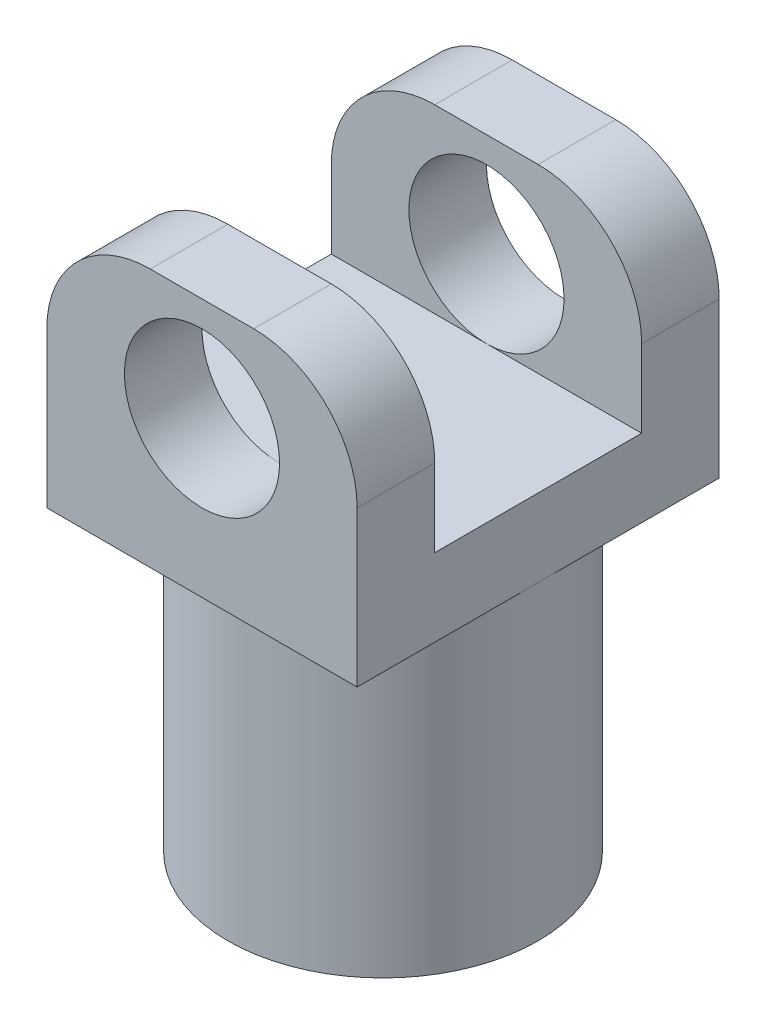
ISO-10303-21;
HEADER;
FILE_DESCRIPTION(('STEP AP214'),'2;1');
FILE_NAME('part.step','',(''),(''),'','','');
FILE_SCHEMA(('AUTOMOTIVE_DESIGN { 1 0 10303 214 1 1 1 1 }'));
ENDSEC;
DATA;
#1=APPLICATION_CONTEXT('core data for automotive mechanical design processes');
#2=APPLICATION_PROTOCOL_DEFINITION('international standard','automotive_design',2000,#1);
#3=PRODUCT_CONTEXT('',#1,'mechanical');
#4=PRODUCT('Part','Part','',(#3));
#5=PRODUCT_RELATED_PRODUCT_CATEGORY('part','',(#4));
#6=PRODUCT_DEFINITION_FORMATION('','',#4);
#7=PRODUCT_DEFINITION_CONTEXT('part definition',#1,'design');
#8=PRODUCT_DEFINITION('design','',#6,#7);
#9=PRODUCT_DEFINITION_SHAPE('','',#8);
#10=(LENGTH_UNIT() NAMED_UNIT(*) SI_UNIT(.MILLI.,.METRE.));
#11=(NAMED_UNIT(*) PLANE_ANGLE_UNIT() SI_UNIT($,.RADIAN.));
#12=(NAMED_UNIT(*) SI_UNIT($,.STERADIAN.) SOLID_ANGLE_UNIT());
#13=UNCERTAINTY_MEASURE_WITH_UNIT(LENGTH_MEASURE(1.E-05),#10,'distance_accuracy_value','');
#14=(GEOMETRIC_REPRESENTATION_CONTEXT(3) GLOBAL_UNCERTAINTY_ASSIGNED_CONTEXT((#13)) GLOBAL_UNIT_ASSIGNED_CONTEXT((#10,
#11,#12)) REPRESENTATION_CONTEXT('',''));
#15=CARTESIAN_POINT('',(0.,0.,0.));
#16=DIRECTION('',(0.,0.,1.));
#17=DIRECTION('',(1.,0.,0.));
#18=AXIS2_PLACEMENT_3D('',#15,#16,#17);
#19=CARTESIAN_POINT('',(-15.,-12.5,35.));
#20=DIRECTION('',(0.,1.,0.));
#21=DIRECTION('',(0.,0.,1.));
#22=AXIS2_PLACEMENT_3D('',#19,#20,#21);
#23=PLANE('',#22);
#24=CARTESIAN_POINT('',(0.,-12.5,17.5));
#25=DIRECTION('',(0.,-1.,0.));
#26=DIRECTION('',(0.,0.,-1.));
#27=AXIS2_PLACEMENT_3D('',#24,#25,#26);
#28=CIRCLE('',#27,15.);
#29=CARTESIAN_POINT('',(15.,-12.5,17.5));
#30=VERTEX_POINT('',#29);
#31=CARTESIAN_POINT('',(-15.,-12.5,17.5));
#32=VERTEX_POINT('',#31);
#33=EDGE_CURVE('E43',#30,#32,#28,.T.);
#34=ORIENTED_EDGE('',*,*,#33,.F.);
#35=DIRECTION('',(0.,0.,-1.));
#36=VECTOR('',#35,1.);
#37=CARTESIAN_POINT('',(15.,-12.5,35.));
#38=LINE('',#37,#36);
#39=CARTESIAN_POINT('',(15.,-12.5,35.));
#40=VERTEX_POINT('',#39);
#41=EDGE_CURVE('E135',#40,#30,#38,.T.);
#42=ORIENTED_EDGE('',*,*,#41,.F.);
#43=DIRECTION('',(1.,0.,0.));
#44=VECTOR('',#43,1.);
#45=CARTESIAN_POINT('',(-15.,-12.5,35.));
#46=LINE('',#45,#44);
#47=CARTESIAN_POINT('',(-15.,-12.5,35.));
#48=VERTEX_POINT('',#47);
#49=EDGE_CURVE('E152',#48,#40,#46,.T.);
#50=ORIENTED_EDGE('',*,*,#49,.F.);
#51=DIRECTION('',(0.,0.,-1.));
#52=VECTOR('',#51,1.);
#53=CARTESIAN_POINT('',(-15.,-12.5,35.));
#54=LINE('',#53,#52);
#55=EDGE_CURVE('E156',#48,#32,#54,.T.);
#56=ORIENTED_EDGE('',*,*,#55,.T.);
#57=EDGE_LOOP('',(#34,#42,#50,#56));
#58=FACE_BOUND('',#57,.T.);
#59=ADVANCED_FACE('F33',(#58),#23,.F.);
#60=CARTESIAN_POINT('',(5.,2.5,35.));
#61=DIRECTION('',(0.,0.,-1.));
#62=DIRECTION('',(-1.,0.,0.));
#63=AXIS2_PLACEMENT_3D('',#60,#61,#62);
#64=CYLINDRICAL_SURFACE('',#63,10.);
#65=DIRECTION('',(0.,0.,-1.));
#66=VECTOR('',#65,1.);
#67=CARTESIAN_POINT('',(5.,12.5,35.));
#68=LINE('',#67,#66);
#69=CARTESIAN_POINT('',(5.,12.5,7.5));
#70=VERTEX_POINT('',#69);
#71=CARTESIAN_POINT('',(5.,12.5,0.));
#72=VERTEX_POINT('',#71);
#73=EDGE_CURVE('E232',#70,#72,#68,.T.);
#74=ORIENTED_EDGE('',*,*,#73,.F.);
#75=CARTESIAN_POINT('',(5.,2.5,7.5));
#76=DIRECTION('',(0.,0.,-1.));
#77=DIRECTION('',(-1.,0.,0.));
#78=AXIS2_PLACEMENT_3D('',#75,#76,#77);
#79=CIRCLE('',#78,10.);
#80=CARTESIAN_POINT('',(15.,2.5,7.5));
#81=VERTEX_POINT('',#80);
#82=EDGE_CURVE('E270',#70,#81,#79,.T.);
#83=ORIENTED_EDGE('',*,*,#82,.T.);
#84=DIRECTION('',(0.,0.,-1.));
#85=VECTOR('',#84,1.);
#86=CARTESIAN_POINT('',(15.,2.5,35.));
#87=LINE('',#86,#85);
#88=CARTESIAN_POINT('',(15.,2.5,0.));
#89=VERTEX_POINT('',#88);
#90=EDGE_CURVE('E227',#81,#89,#87,.T.);
#91=ORIENTED_EDGE('',*,*,#90,.T.);
#92=CARTESIAN_POINT('',(5.,2.5,0.));
#93=DIRECTION('',(0.,0.,1.));
#94=DIRECTION('',(-1.,0.,0.));
#95=AXIS2_PLACEMENT_3D('',#92,#93,#94);
#96=CIRCLE('',#95,10.);
#97=EDGE_CURVE('E252',#89,#72,#96,.T.);
#98=ORIENTED_EDGE('',*,*,#97,.T.);
#99=EDGE_LOOP('',(#74,#83,#91,#98));
#100=FACE_BOUND('',#99,.T.);
#101=ADVANCED_FACE('F178',(#100),#64,.T.);
#102=CARTESIAN_POINT('',(-5.,12.5,35.));
#103=DIRECTION('',(0.,-1.,0.));
#104=DIRECTION('',(0.,0.,-1.));
#105=AXIS2_PLACEMENT_3D('',#102,#103,#104);
#106=PLANE('',#105);
#107=DIRECTION('',(0.,0.,-1.));
#108=VECTOR('',#107,1.);
#109=CARTESIAN_POINT('',(-5.,12.5,35.));
#110=LINE('',#109,#108);
#111=CARTESIAN_POINT('',(-5.,12.5,7.5));
#112=VERTEX_POINT('',#111);
#113=CARTESIAN_POINT('',(-5.,12.5,0.));
#114=VERTEX_POINT('',#113);
#115=EDGE_CURVE('E236',#112,#114,#110,.T.);
#116=ORIENTED_EDGE('',*,*,#115,.F.);
#117=DIRECTION('',(1.,0.,0.));
#118=VECTOR('',#117,1.);
#119=CARTESIAN_POINT('',(-35.,12.5,7.5));
#120=LINE('',#119,#118);
#121=EDGE_CURVE('E290',#112,#70,#120,.T.);
#122=ORIENTED_EDGE('',*,*,#121,.T.);
#123=ORIENTED_EDGE('',*,*,#73,.T.);
#124=DIRECTION('',(-1.,0.,0.));
#125=VECTOR('',#124,1.);
#126=CARTESIAN_POINT('',(-5.,12.5,0.));
#127=LINE('',#126,#125);
#128=EDGE_CURVE('E249',#72,#114,#127,.T.);
#129=ORIENTED_EDGE('',*,*,#128,.T.);
#130=EDGE_LOOP('',(#116,#122,#123,#129));
#131=FACE_BOUND('',#130,.T.);
#132=ADVANCED_FACE('F183',(#131),#106,.F.);
#133=CARTESIAN_POINT('',(-5.,2.5,35.));
#134=DIRECTION('',(0.,0.,-1.));
#135=DIRECTION('',(-1.,0.,0.));
#136=AXIS2_PLACEMENT_3D('',#133,#134,#135);
#137=CYLINDRICAL_SURFACE('',#136,10.);
#138=DIRECTION('',(0.,0.,-1.));
#139=VECTOR('',#138,1.);
#140=CARTESIAN_POINT('',(-15.,2.5,35.));
#141=LINE('',#140,#139);
#142=CARTESIAN_POINT('',(-15.,2.5,7.5));
#143=VERTEX_POINT('',#142);
#144=CARTESIAN_POINT('',(-15.,2.5,0.));
#145=VERTEX_POINT('',#144);
#146=EDGE_CURVE('E240',#143,#145,#141,.T.);
#147=ORIENTED_EDGE('',*,*,#146,.F.);
#148=CARTESIAN_POINT('',(-5.,2.5,7.5));
#149=DIRECTION('',(0.,0.,-1.));
#150=DIRECTION('',(-1.,0.,0.));
#151=AXIS2_PLACEMENT_3D('',#148,#149,#150);
#152=CIRCLE('',#151,10.);
#153=EDGE_CURVE('E275',#143,#112,#152,.T.);
#154=ORIENTED_EDGE('',*,*,#153,.T.);
#155=ORIENTED_EDGE('',*,*,#115,.T.);
#156=CARTESIAN_POINT('',(-5.,2.5,0.));
#157=DIRECTION('',(0.,0.,1.));
#158=DIRECTION('',(1.,0.,0.));
#159=AXIS2_PLACEMENT_3D('',#156,#157,#158);
#160=CIRCLE('',#159,10.);
#161=EDGE_CURVE('E246',#114,#145,#160,.T.);
#162=ORIENTED_EDGE('',*,*,#161,.T.);
#163=EDGE_LOOP('',(#147,#154,#155,#162));
#164=FACE_BOUND('',#163,.T.);
#165=ADVANCED_FACE('F207',(#164),#137,.T.);
#166=CARTESIAN_POINT('',(0.,2.5,35.));
#167=DIRECTION('',(0.,0.,-1.));
#168=DIRECTION('',(-1.,0.,0.));
#169=AXIS2_PLACEMENT_3D('',#166,#167,#168);
#170=CYLINDRICAL_SURFACE('',#169,7.5);
#171=CARTESIAN_POINT('',(0.,2.5,7.5));
#172=DIRECTION('',(0.,0.,-1.));
#173=DIRECTION('',(-1.,0.,0.));
#174=AXIS2_PLACEMENT_3D('',#171,#172,#173);
#175=CIRCLE('',#174,7.5);
#176=CARTESIAN_POINT('',(0.,-5.,7.5));
#177=VERTEX_POINT('',#176);
#178=EDGE_CURVE('E37',#177,#177,#175,.T.);
#179=ORIENTED_EDGE('',*,*,#178,.F.);
#180=EDGE_LOOP('',(#179));
#181=FACE_BOUND('',#180,.T.);
#182=CARTESIAN_POINT('',(0.,2.5,0.));
#183=DIRECTION('',(0.,0.,1.));
#184=DIRECTION('',(1.,0.,0.));
#185=AXIS2_PLACEMENT_3D('',#182,#183,#184);
#186=CIRCLE('',#185,7.5);
#187=CARTESIAN_POINT('',(7.5,2.5,0.));
#188=VERTEX_POINT('',#187);
#189=EDGE_CURVE('E267',#188,#188,#186,.T.);
#190=ORIENTED_EDGE('',*,*,#189,.F.);
#191=EDGE_LOOP('',(#190));
#192=FACE_BOUND('',#191,.T.);
#193=ADVANCED_FACE('F198',(#181,#192),#170,.F.);
#194=CARTESIAN_POINT('',(-5.,2.5,35.));
#195=DIRECTION('',(0.,0.,1.));
#196=DIRECTION('',(1.,0.,0.));
#197=AXIS2_PLACEMENT_3D('',#194,#195,#196);
#198=PLANE('',#197);
#199=DIRECTION('',(0.,1.,0.));
#200=VECTOR('',#199,1.);
#201=CARTESIAN_POINT('',(15.,2.5,35.));
#202=LINE('',#201,#200);
#203=CARTESIAN_POINT('',(15.,2.5,35.));
#204=VERTEX_POINT('',#203);
#205=EDGE_CURVE('E142',#40,#204,#202,.T.);
#206=ORIENTED_EDGE('',*,*,#205,.T.);
#207=CARTESIAN_POINT('',(5.,2.5,35.));
#208=DIRECTION('',(0.,0.,1.));
#209=DIRECTION('',(-1.,0.,0.));
#210=AXIS2_PLACEMENT_3D('',#207,#208,#209);
#211=CIRCLE('',#210,10.);
#212=CARTESIAN_POINT('',(5.,12.5,35.));
#213=VERTEX_POINT('',#212);
#214=EDGE_CURVE('E224',#204,#213,#211,.T.);
#215=ORIENTED_EDGE('',*,*,#214,.T.);
#216=DIRECTION('',(-1.,0.,0.));
#217=VECTOR('',#216,1.);
#218=CARTESIAN_POINT('',(-5.,12.5,35.));
#219=LINE('',#218,#217);
#220=CARTESIAN_POINT('',(-5.,12.5,35.));
#221=VERTEX_POINT('',#220);
#222=EDGE_CURVE('E263',#213,#221,#219,.T.);
#223=ORIENTED_EDGE('',*,*,#222,.T.);
#224=CARTESIAN_POINT('',(-5.,2.5,35.));
#225=DIRECTION('',(0.,0.,1.));
#226=DIRECTION('',(1.,0.,0.));
#227=AXIS2_PLACEMENT_3D('',#224,#225,#226);
#228=CIRCLE('',#227,10.);
#229=CARTESIAN_POINT('',(-15.,2.5,35.));
#230=VERTEX_POINT('',#229);
#231=EDGE_CURVE('E261',#221,#230,#228,.T.);
#232=ORIENTED_EDGE('',*,*,#231,.T.);
#233=DIRECTION('',(0.,-1.,0.));
#234=VECTOR('',#233,1.);
#235=CARTESIAN_POINT('',(-15.,2.5,35.));
#236=LINE('',#235,#234);
#237=EDGE_CURVE('E259',#230,#48,#236,.T.);
#238=ORIENTED_EDGE('',*,*,#237,.T.);
#239=ORIENTED_EDGE('',*,*,#49,.T.);
#240=EDGE_LOOP('',(#206,#215,#223,#232,#238,#239));
#241=FACE_BOUND('',#240,.T.);
#242=CARTESIAN_POINT('',(0.,2.5,35.));
#243=DIRECTION('',(0.,0.,1.));
#244=DIRECTION('',(1.,0.,0.));
#245=AXIS2_PLACEMENT_3D('',#242,#243,#244);
#246=CIRCLE('',#245,7.5);
#247=CARTESIAN_POINT('',(7.5,2.5,35.));
#248=VERTEX_POINT('',#247);
#249=EDGE_CURVE('E257',#248,#248,#246,.T.);
#250=ORIENTED_EDGE('',*,*,#249,.F.);
#251=EDGE_LOOP('',(#250));
#252=FACE_BOUND('',#251,.T.);
#253=ADVANCED_FACE('F418',(#241,#252),#198,.T.);
#254=CARTESIAN_POINT('',(-5.,2.5,0.));
#255=DIRECTION('',(0.,0.,1.));
#256=DIRECTION('',(1.,0.,0.));
#257=AXIS2_PLACEMENT_3D('',#254,#255,#256);
#258=PLANE('',#257);
#259=DIRECTION('',(0.,1.,0.));
#260=VECTOR('',#259,1.);
#261=CARTESIAN_POINT('',(15.,2.5,0.));
#262=LINE('',#261,#260);
#263=CARTESIAN_POINT('',(15.,-12.5,0.));
#264=VERTEX_POINT('',#263);
#265=EDGE_CURVE('E255',#264,#89,#262,.T.);
#266=ORIENTED_EDGE('',*,*,#265,.F.);
#267=DIRECTION('',(1.,0.,0.));
#268=VECTOR('',#267,1.);
#269=CARTESIAN_POINT('',(-15.,-12.5,0.));
#270=LINE('',#269,#268);
#271=CARTESIAN_POINT('',(-15.,-12.5,0.));
#272=VERTEX_POINT('',#271);
#273=EDGE_CURVE('E150',#272,#264,#270,.T.);
#274=ORIENTED_EDGE('',*,*,#273,.F.);
#275=DIRECTION('',(0.,-1.,0.));
#276=VECTOR('',#275,1.);
#277=CARTESIAN_POINT('',(-15.,2.5,0.));
#278=LINE('',#277,#276);
#279=EDGE_CURVE('E243',#145,#272,#278,.T.);
#280=ORIENTED_EDGE('',*,*,#279,.F.);
#281=ORIENTED_EDGE('',*,*,#161,.F.);
#282=ORIENTED_EDGE('',*,*,#128,.F.);
#283=ORIENTED_EDGE('',*,*,#97,.F.);
#284=EDGE_LOOP('',(#266,#274,#280,#281,#282,#283));
#285=FACE_BOUND('',#284,.T.);
#286=ORIENTED_EDGE('',*,*,#189,.T.);
#287=EDGE_LOOP('',(#286));
#288=FACE_BOUND('',#287,.T.);
#289=ADVANCED_FACE('F217',(#285,#288),#258,.F.);
#290=CARTESIAN_POINT('',(15.,2.5,35.));
#291=DIRECTION('',(-1.,0.,0.));
#292=DIRECTION('',(0.,-1.,0.));
#293=AXIS2_PLACEMENT_3D('',#290,#291,#292);
#294=PLANE('',#293);
#295=ORIENTED_EDGE('',*,*,#90,.F.);
#296=DIRECTION('',(0.,1.,0.));
#297=VECTOR('',#296,1.);
#298=CARTESIAN_POINT('',(15.,-5.00000000000001,7.5));
#299=LINE('',#298,#297);
#300=CARTESIAN_POINT('',(15.,-5.00000000000001,7.5));
#301=VERTEX_POINT('',#300);
#302=EDGE_CURVE('E294',#301,#81,#299,.T.);
#303=ORIENTED_EDGE('',*,*,#302,.F.);
#304=DIRECTION('',(0.,0.,-1.));
#305=VECTOR('',#304,1.);
#306=CARTESIAN_POINT('',(15.,-5.00000000000001,27.5));
#307=LINE('',#306,#305);
#308=CARTESIAN_POINT('',(15.,-5.00000000000001,27.5));
#309=VERTEX_POINT('',#308);
#310=EDGE_CURVE('E302',#309,#301,#307,.T.);
#311=ORIENTED_EDGE('',*,*,#310,.F.);
#312=DIRECTION('',(0.,-1.,0.));
#313=VECTOR('',#312,1.);
#314=CARTESIAN_POINT('',(15.,12.5,27.5));
#315=LINE('',#314,#313);
#316=CARTESIAN_POINT('',(15.,2.5,27.5));
#317=VERTEX_POINT('',#316);
#318=EDGE_CURVE('E305',#317,#309,#315,.T.);
#319=ORIENTED_EDGE('',*,*,#318,.F.);
#320=EDGE_CURVE('E220',#204,#317,#87,.T.);
#321=ORIENTED_EDGE('',*,*,#320,.F.);
#322=ORIENTED_EDGE('',*,*,#205,.F.);
#323=ORIENTED_EDGE('',*,*,#41,.T.);
#324=EDGE_CURVE('E138',#30,#264,#38,.T.);
#325=ORIENTED_EDGE('',*,*,#324,.T.);
#326=ORIENTED_EDGE('',*,*,#265,.T.);
#327=EDGE_LOOP('',(#295,#303,#311,#319,#321,#322,#323,#325,#326));
#328=FACE_BOUND('',#327,.T.);
#329=ADVANCED_FACE('F35',(#328),#294,.F.);
#330=ORIENTED_EDGE('',*,*,#320,.T.);
#331=CARTESIAN_POINT('',(5.,2.5,27.5));
#332=DIRECTION('',(0.,0.,1.));
#333=DIRECTION('',(0.,-1.,0.));
#334=AXIS2_PLACEMENT_3D('',#331,#332,#333);
#335=CIRCLE('',#334,10.);
#336=CARTESIAN_POINT('',(5.,12.5,27.5));
#337=VERTEX_POINT('',#336);
#338=EDGE_CURVE('E222',#317,#337,#335,.T.);
#339=ORIENTED_EDGE('',*,*,#338,.T.);
#340=EDGE_CURVE('E229',#213,#337,#68,.T.);
#341=ORIENTED_EDGE('',*,*,#340,.F.);
#342=ORIENTED_EDGE('',*,*,#214,.F.);
#343=EDGE_LOOP('',(#330,#339,#341,#342));
#344=FACE_BOUND('',#343,.T.);
#345=ADVANCED_FACE('F185',(#344),#64,.T.);
#346=ORIENTED_EDGE('',*,*,#340,.T.);
#347=DIRECTION('',(1.,0.,0.));
#348=VECTOR('',#347,1.);
#349=CARTESIAN_POINT('',(-35.,12.5,27.5));
#350=LINE('',#349,#348);
#351=CARTESIAN_POINT('',(-5.,12.5,27.5));
#352=VERTEX_POINT('',#351);
#353=EDGE_CURVE('E291',#352,#337,#350,.T.);
#354=ORIENTED_EDGE('',*,*,#353,.F.);
#355=EDGE_CURVE('E233',#221,#352,#110,.T.);
#356=ORIENTED_EDGE('',*,*,#355,.F.);
#357=ORIENTED_EDGE('',*,*,#222,.F.);
#358=EDGE_LOOP('',(#346,#354,#356,#357));
#359=FACE_BOUND('',#358,.T.);
#360=ADVANCED_FACE('F204',(#359),#106,.F.);
#361=ORIENTED_EDGE('',*,*,#355,.T.);
#362=CARTESIAN_POINT('',(-5.,2.5,27.5));
#363=DIRECTION('',(0.,0.,1.));
#364=DIRECTION('',(0.,-1.,0.));
#365=AXIS2_PLACEMENT_3D('',#362,#363,#364);
#366=CIRCLE('',#365,10.);
#367=CARTESIAN_POINT('',(-15.,2.5,27.5));
#368=VERTEX_POINT('',#367);
#369=EDGE_CURVE('E284',#352,#368,#366,.T.);
#370=ORIENTED_EDGE('',*,*,#369,.T.);
#371=EDGE_CURVE('E237',#230,#368,#141,.T.);
#372=ORIENTED_EDGE('',*,*,#371,.F.);
#373=ORIENTED_EDGE('',*,*,#231,.F.);
#374=EDGE_LOOP('',(#361,#370,#372,#373));
#375=FACE_BOUND('',#374,.T.);
#376=ADVANCED_FACE('F199',(#375),#137,.T.);
#377=CARTESIAN_POINT('',(-15.,2.5,35.));
#378=DIRECTION('',(1.,0.,0.));
#379=DIRECTION('',(0.,1.,0.));
#380=AXIS2_PLACEMENT_3D('',#377,#378,#379);
#381=PLANE('',#380);
#382=DIRECTION('',(0.,0.,-1.));
#383=VECTOR('',#382,1.);
#384=CARTESIAN_POINT('',(-15.,-5.00000000000001,35.));
#385=LINE('',#384,#383);
#386=CARTESIAN_POINT('',(-15.,-5.00000000000001,27.5));
#387=VERTEX_POINT('',#386);
#388=CARTESIAN_POINT('',(-15.,-5.00000000000001,7.5));
#389=VERTEX_POINT('',#388);
#390=EDGE_CURVE('E281',#387,#389,#385,.T.);
#391=ORIENTED_EDGE('',*,*,#390,.T.);
#392=DIRECTION('',(0.,1.,0.));
#393=VECTOR('',#392,1.);
#394=CARTESIAN_POINT('',(-15.,2.5,7.5));
#395=LINE('',#394,#393);
#396=EDGE_CURVE('E278',#389,#143,#395,.T.);
#397=ORIENTED_EDGE('',*,*,#396,.T.);
#398=ORIENTED_EDGE('',*,*,#146,.T.);
#399=ORIENTED_EDGE('',*,*,#279,.T.);
#400=EDGE_CURVE('E146',#32,#272,#54,.T.);
#401=ORIENTED_EDGE('',*,*,#400,.F.);
#402=ORIENTED_EDGE('',*,*,#55,.F.);
#403=ORIENTED_EDGE('',*,*,#237,.F.);
#404=ORIENTED_EDGE('',*,*,#371,.T.);
#405=DIRECTION('',(0.,-1.,0.));
#406=VECTOR('',#405,1.);
#407=CARTESIAN_POINT('',(-15.,2.5,27.5));
#408=LINE('',#407,#406);
#409=EDGE_CURVE('E287',#368,#387,#408,.T.);
#410=ORIENTED_EDGE('',*,*,#409,.T.);
#411=EDGE_LOOP('',(#391,#397,#398,#399,#401,#402,#403,#404,#410));
#412=FACE_BOUND('',#411,.T.);
#413=ADVANCED_FACE('F190',(#412),#381,.F.);
#414=EDGE_CURVE('E11',#32,#30,#28,.T.);
#415=ORIENTED_EDGE('',*,*,#414,.F.);
#416=ORIENTED_EDGE('',*,*,#400,.T.);
#417=ORIENTED_EDGE('',*,*,#273,.T.);
#418=ORIENTED_EDGE('',*,*,#324,.F.);
#419=EDGE_LOOP('',(#415,#416,#417,#418));
#420=FACE_BOUND('',#419,.T.);
#421=ADVANCED_FACE('F148',(#420),#23,.F.);
#422=CARTESIAN_POINT('',(0.,2.5,27.5));
#423=DIRECTION('',(0.,0.,1.));
#424=DIRECTION('',(0.,-1.,0.));
#425=AXIS2_PLACEMENT_3D('',#422,#423,#424);
#426=CIRCLE('',#425,7.5);
#427=CARTESIAN_POINT('',(0.,-5.00000000000001,27.5));
#428=VERTEX_POINT('',#427);
#429=EDGE_CURVE('E226',#428,#428,#426,.T.);
#430=ORIENTED_EDGE('',*,*,#429,.F.);
#431=EDGE_LOOP('',(#430));
#432=FACE_BOUND('',#431,.T.);
#433=ORIENTED_EDGE('',*,*,#249,.T.);
#434=EDGE_LOOP('',(#433));
#435=FACE_BOUND('',#434,.T.);
#436=ADVANCED_FACE('F189',(#432,#435),#170,.F.);
#437=CARTESIAN_POINT('',(-35.,-5.00000000000001,7.5));
#438=DIRECTION('',(0.,0.,-1.));
#439=DIRECTION('',(-1.,0.,0.));
#440=AXIS2_PLACEMENT_3D('',#437,#438,#439);
#441=PLANE('',#440);
#442=ORIENTED_EDGE('',*,*,#121,.F.);
#443=ORIENTED_EDGE('',*,*,#153,.F.);
#444=ORIENTED_EDGE('',*,*,#396,.F.);
#445=DIRECTION('',(1.,0.,0.));
#446=VECTOR('',#445,1.);
#447=CARTESIAN_POINT('',(-35.,-5.00000000000001,7.5));
#448=LINE('',#447,#446);
#449=EDGE_CURVE('E298',#389,#177,#448,.T.);
#450=ORIENTED_EDGE('',*,*,#449,.T.);
#451=ORIENTED_EDGE('',*,*,#178,.T.);
#452=EDGE_CURVE('E296',#177,#301,#448,.T.);
#453=ORIENTED_EDGE('',*,*,#452,.T.);
#454=ORIENTED_EDGE('',*,*,#302,.T.);
#455=ORIENTED_EDGE('',*,*,#82,.F.);
#456=EDGE_LOOP('',(#442,#443,#444,#450,#451,#453,#454,#455));
#457=FACE_BOUND('',#456,.T.);
#458=ADVANCED_FACE('F195',(#457),#441,.F.);
#459=CARTESIAN_POINT('',(-35.,-5.00000000000001,27.5));
#460=DIRECTION('',(0.,-1.,0.));
#461=DIRECTION('',(1.,0.,0.));
#462=AXIS2_PLACEMENT_3D('',#459,#460,#461);
#463=PLANE('',#462);
#464=DIRECTION('',(1.,0.,0.));
#465=VECTOR('',#464,1.);
#466=CARTESIAN_POINT('',(-35.,-5.00000000000001,27.5));
#467=LINE('',#466,#465);
#468=EDGE_CURVE('E56',#387,#428,#467,.T.);
#469=ORIENTED_EDGE('',*,*,#468,.T.);
#470=EDGE_CURVE('E293',#428,#309,#467,.T.);
#471=ORIENTED_EDGE('',*,*,#470,.T.);
#472=ORIENTED_EDGE('',*,*,#310,.T.);
#473=ORIENTED_EDGE('',*,*,#452,.F.);
#474=ORIENTED_EDGE('',*,*,#449,.F.);
#475=ORIENTED_EDGE('',*,*,#390,.F.);
#476=EDGE_LOOP('',(#469,#471,#472,#473,#474,#475));
#477=FACE_BOUND('',#476,.T.);
#478=ADVANCED_FACE('F173',(#477),#463,.F.);
#479=CARTESIAN_POINT('',(-35.,12.5,27.5));
#480=DIRECTION('',(0.,0.,1.));
#481=DIRECTION('',(0.,-1.,0.));
#482=AXIS2_PLACEMENT_3D('',#479,#480,#481);
#483=PLANE('',#482);
#484=ORIENTED_EDGE('',*,*,#318,.T.);
#485=ORIENTED_EDGE('',*,*,#470,.F.);
#486=ORIENTED_EDGE('',*,*,#429,.T.);
#487=ORIENTED_EDGE('',*,*,#468,.F.);
#488=ORIENTED_EDGE('',*,*,#409,.F.);
#489=ORIENTED_EDGE('',*,*,#369,.F.);
#490=ORIENTED_EDGE('',*,*,#353,.T.);
#491=ORIENTED_EDGE('',*,*,#338,.F.);
#492=EDGE_LOOP('',(#484,#485,#486,#487,#488,#489,#490,#491));
#493=FACE_BOUND('',#492,.T.);
#494=ADVANCED_FACE('F163',(#493),#483,.F.);
#495=CARTESIAN_POINT('',(0.,-42.5,17.5));
#496=DIRECTION('',(0.,1.,0.));
#497=DIRECTION('',(0.,0.,1.));
#498=AXIS2_PLACEMENT_3D('',#495,#496,#497);
#499=CYLINDRICAL_SURFACE('',#498,15.);
#500=CARTESIAN_POINT('',(0.,-42.5,17.5));
#501=DIRECTION('',(0.,-1.,0.));
#502=DIRECTION('',(0.,0.,-1.));
#503=AXIS2_PLACEMENT_3D('',#500,#501,#502);
#504=CIRCLE('',#503,15.);
#505=CARTESIAN_POINT('',(0.,-42.5,2.5));
#506=VERTEX_POINT('',#505);
#507=EDGE_CURVE('E158',#506,#506,#504,.T.);
#508=ORIENTED_EDGE('',*,*,#507,.F.);
#509=EDGE_LOOP('',(#508));
#510=FACE_BOUND('',#509,.T.);
#511=ORIENTED_EDGE('',*,*,#33,.T.);
#512=ORIENTED_EDGE('',*,*,#414,.T.);
#513=EDGE_LOOP('',(#511,#512));
#514=FACE_BOUND('',#513,.T.);
#515=ADVANCED_FACE('F160',(#510,#514),#499,.T.);
#516=CARTESIAN_POINT('',(0.,-42.5,17.5));
#517=DIRECTION('',(0.,-1.,0.));
#518=DIRECTION('',(0.,0.,-1.));
#519=AXIS2_PLACEMENT_3D('',#516,#517,#518);
#520=PLANE('',#519);
#521=CARTESIAN_POINT('',(0.,-42.5,17.5));
#522=DIRECTION('',(0.,-1.,0.));
#523=DIRECTION('',(0.,0.,-1.));
#524=AXIS2_PLACEMENT_3D('',#521,#522,#523);
#525=CIRCLE('',#524,9.525);
#526=CARTESIAN_POINT('',(0.,-42.5,7.975));
#527=VERTEX_POINT('',#526);
#528=EDGE_CURVE('E310',#527,#527,#525,.T.);
#529=ORIENTED_EDGE('',*,*,#528,.F.);
#530=EDGE_LOOP('',(#529));
#531=FACE_BOUND('',#530,.T.);
#532=ORIENTED_EDGE('',*,*,#507,.T.);
#533=EDGE_LOOP('',(#532));
#534=FACE_BOUND('',#533,.T.);
#535=ADVANCED_FACE('F162',(#531,#534),#520,.T.);
#536=CARTESIAN_POINT('',(0.,-12.5,17.5));
#537=DIRECTION('',(0.,-1.,0.));
#538=DIRECTION('',(0.,0.,-1.));
#539=AXIS2_PLACEMENT_3D('',#536,#537,#538);
#540=CYLINDRICAL_SURFACE('',#539,9.525);
#541=CARTESIAN_POINT('',(0.,-12.5,17.5));
#542=DIRECTION('',(0.,-1.,0.));
#543=DIRECTION('',(0.,0.,-1.));
#544=AXIS2_PLACEMENT_3D('',#541,#542,#543);
#545=CIRCLE('',#544,9.525);
#546=CARTESIAN_POINT('',(0.,-12.5,7.975));
#547=VERTEX_POINT('',#546);
#548=EDGE_CURVE('E159',#547,#547,#545,.T.);
#549=ORIENTED_EDGE('',*,*,#548,.F.);
#550=EDGE_LOOP('',(#549));
#551=FACE_BOUND('',#550,.T.);
#552=ORIENTED_EDGE('',*,*,#528,.T.);
#553=EDGE_LOOP('',(#552));
#554=FACE_BOUND('',#553,.T.);
#555=ADVANCED_FACE('F170',(#551,#554),#540,.F.);
#556=CARTESIAN_POINT('',(0.,-12.5,17.5));
#557=DIRECTION('',(0.,-1.,0.));
#558=DIRECTION('',(0.,0.,-1.));
#559=AXIS2_PLACEMENT_3D('',#556,#557,#558);
#560=PLANE('',#559);
#561=ORIENTED_EDGE('',*,*,#548,.T.);
#562=EDGE_LOOP('',(#561));
#563=FACE_BOUND('',#562,.T.);
#564=ADVANCED_FACE('F316',(#563),#560,.T.);
#565=CLOSED_SHELL('',(#59,#101,#132,#165,#193,#253,#289,#329,#345,#360,#376,#413,#421,#436,#458,
#478,#494,#515,#535,#555,#564));
#566=MANIFOLD_SOLID_BREP('B2',#565);
#567=ADVANCED_BREP_SHAPE_REPRESENTATION('',(#18,#566),#14);
#568=SHAPE_DEFINITION_REPRESENTATION(#9,#567);
ENDSEC;
END-ISO-10303-21;
